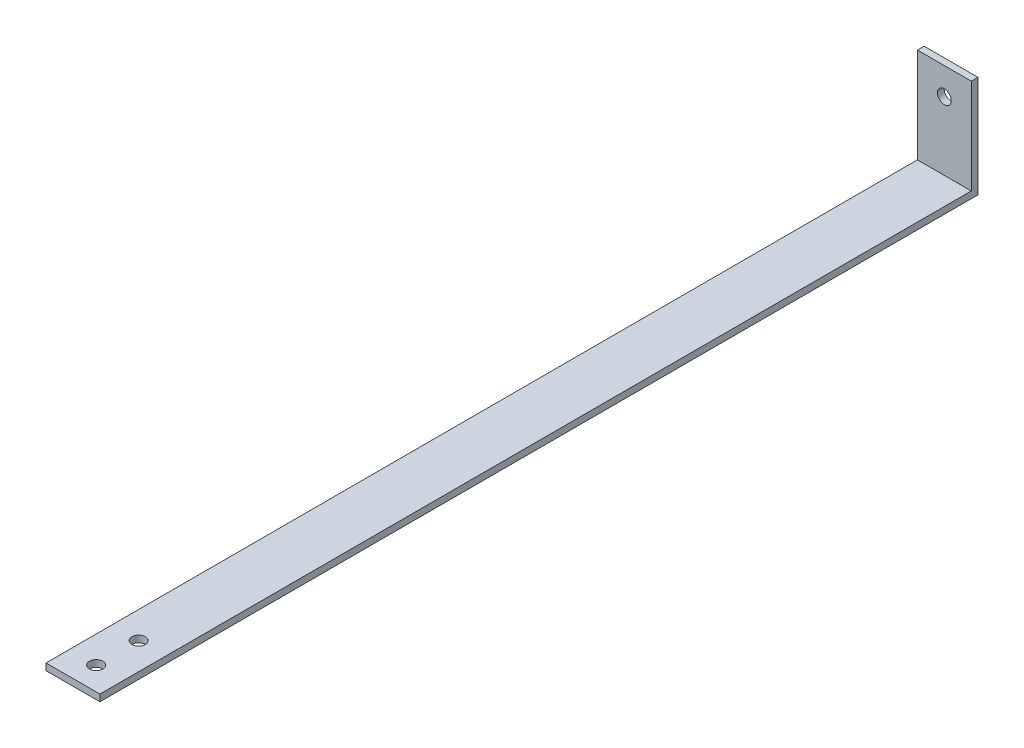
ISO-10303-21;
HEADER;
FILE_DESCRIPTION(('STEP AP214'),'2;1');
FILE_NAME('part.step','',(''),(''),'','','');
FILE_SCHEMA(('AUTOMOTIVE_DESIGN { 1 0 10303 214 1 1 1 1 }'));
ENDSEC;
DATA;
#1=APPLICATION_CONTEXT('core data for automotive mechanical design processes');
#2=APPLICATION_PROTOCOL_DEFINITION('international standard','automotive_design',2000,#1);
#3=PRODUCT_CONTEXT('',#1,'mechanical');
#4=PRODUCT('Part','Part','',(#3));
#5=PRODUCT_RELATED_PRODUCT_CATEGORY('part','',(#4));
#6=PRODUCT_DEFINITION_FORMATION('','',#4);
#7=PRODUCT_DEFINITION_CONTEXT('part definition',#1,'design');
#8=PRODUCT_DEFINITION('design','',#6,#7);
#9=PRODUCT_DEFINITION_SHAPE('','',#8);
#10=(LENGTH_UNIT() NAMED_UNIT(*) SI_UNIT(.MILLI.,.METRE.));
#11=(NAMED_UNIT(*) PLANE_ANGLE_UNIT() SI_UNIT($,.RADIAN.));
#12=(NAMED_UNIT(*) SI_UNIT($,.STERADIAN.) SOLID_ANGLE_UNIT());
#13=UNCERTAINTY_MEASURE_WITH_UNIT(LENGTH_MEASURE(1.E-05),#10,'distance_accuracy_value','');
#14=(GEOMETRIC_REPRESENTATION_CONTEXT(3) GLOBAL_UNCERTAINTY_ASSIGNED_CONTEXT((#13)) GLOBAL_UNIT_ASSIGNED_CONTEXT((#10,
#11,#12)) REPRESENTATION_CONTEXT('',''));
#15=CARTESIAN_POINT('',(0.,0.,0.));
#16=DIRECTION('',(0.,0.,1.));
#17=DIRECTION('',(1.,0.,0.));
#18=AXIS2_PLACEMENT_3D('',#15,#16,#17);
#19=CARTESIAN_POINT('',(50.8,6.3099999999999,6.31000000000004));
#20=DIRECTION('',(0.,0.,-1.));
#21=DIRECTION('',(0.,1.,0.));
#22=AXIS2_PLACEMENT_3D('',#19,#20,#21);
#23=PLANE('',#22);
#24=CARTESIAN_POINT('',(25.4,70.53,6.31000000000003));
#25=DIRECTION('',(0.,0.,-1.));
#26=DIRECTION('',(0.,1.,0.));
#27=AXIS2_PLACEMENT_3D('',#24,#25,#26);
#28=CIRCLE('',#27,6.5);
#29=CARTESIAN_POINT('',(25.4,77.03,6.31000000000003));
#30=VERTEX_POINT('',#29);
#31=EDGE_CURVE('E130',#30,#30,#28,.T.);
#32=ORIENTED_EDGE('',*,*,#31,.T.);
#33=EDGE_LOOP('',(#32));
#34=FACE_BOUND('',#33,.T.);
#35=DIRECTION('',(0.,-1.,0.));
#36=VECTOR('',#35,1.);
#37=CARTESIAN_POINT('',(0.,6.3099999999999,6.31000000000004));
#38=LINE('',#37,#36);
#39=CARTESIAN_POINT('',(0.,95.93,6.31000000000003));
#40=VERTEX_POINT('',#39);
#41=CARTESIAN_POINT('',(0.,6.3099999999999,6.31000000000004));
#42=VERTEX_POINT('',#41);
#43=EDGE_CURVE('E113',#40,#42,#38,.T.);
#44=ORIENTED_EDGE('',*,*,#43,.T.);
#45=DIRECTION('',(-1.,0.,0.));
#46=VECTOR('',#45,1.);
#47=CARTESIAN_POINT('',(50.8,6.3099999999999,6.31000000000004));
#48=LINE('',#47,#46);
#49=CARTESIAN_POINT('',(50.8,6.3099999999999,6.31000000000004));
#50=VERTEX_POINT('',#49);
#51=EDGE_CURVE('E39',#50,#42,#48,.T.);
#52=ORIENTED_EDGE('',*,*,#51,.F.);
#53=DIRECTION('',(0.,-1.,0.));
#54=VECTOR('',#53,1.);
#55=CARTESIAN_POINT('',(50.8,6.3099999999999,6.31000000000004));
#56=LINE('',#55,#54);
#57=CARTESIAN_POINT('',(50.8,95.93,6.31000000000003));
#58=VERTEX_POINT('',#57);
#59=EDGE_CURVE('E118',#58,#50,#56,.T.);
#60=ORIENTED_EDGE('',*,*,#59,.F.);
#61=DIRECTION('',(-1.,0.,0.));
#62=VECTOR('',#61,1.);
#63=CARTESIAN_POINT('',(50.8,95.93,6.31000000000003));
#64=LINE('',#63,#62);
#65=EDGE_CURVE('E119',#58,#40,#64,.T.);
#66=ORIENTED_EDGE('',*,*,#65,.T.);
#67=EDGE_LOOP('',(#44,#52,#60,#66));
#68=FACE_BOUND('',#67,.T.);
#69=ADVANCED_FACE('F32',(#34,#68),#23,.F.);
#70=CARTESIAN_POINT('',(50.8,6.30999999999989,902.2));
#71=DIRECTION('',(0.,-1.,0.));
#72=DIRECTION('',(0.,0.,-1.));
#73=AXIS2_PLACEMENT_3D('',#70,#71,#72);
#74=PLANE('',#73);
#75=CARTESIAN_POINT('',(25.4000000000114,6.30999999999989,805.810000000098));
#76=DIRECTION('',(0.,-1.,0.));
#77=DIRECTION('',(0.,0.,-1.));
#78=AXIS2_PLACEMENT_3D('',#75,#76,#77);
#79=CIRCLE('',#78,6.34999999999976);
#80=CARTESIAN_POINT('',(25.4000000000114,6.30999999999989,799.460000000098));
#81=VERTEX_POINT('',#80);
#82=EDGE_CURVE('E150',#81,#81,#79,.T.);
#83=ORIENTED_EDGE('',*,*,#82,.T.);
#84=EDGE_LOOP('',(#83));
#85=FACE_BOUND('',#84,.T.);
#86=CARTESIAN_POINT('',(25.4000000000121,6.30999999999989,765.810000000098));
#87=DIRECTION('',(0.,-1.,0.));
#88=DIRECTION('',(0.,0.,-1.));
#89=AXIS2_PLACEMENT_3D('',#86,#87,#88);
#90=CIRCLE('',#89,6.34999999999969);
#91=CARTESIAN_POINT('',(25.4000000000121,6.30999999999989,759.460000000098));
#92=VERTEX_POINT('',#91);
#93=EDGE_CURVE('E105',#92,#92,#90,.T.);
#94=ORIENTED_EDGE('',*,*,#93,.T.);
#95=EDGE_LOOP('',(#94));
#96=FACE_BOUND('',#95,.T.);
#97=DIRECTION('',(0.,0.,1.));
#98=VECTOR('',#97,1.);
#99=CARTESIAN_POINT('',(0.,6.30999999999989,902.2));
#100=LINE('',#99,#98);
#101=CARTESIAN_POINT('',(0.,6.30999999999989,827.7));
#102=VERTEX_POINT('',#101);
#103=EDGE_CURVE('E110',#42,#102,#100,.T.);
#104=ORIENTED_EDGE('',*,*,#103,.T.);
#105=DIRECTION('',(1.,0.,0.));
#106=VECTOR('',#105,1.);
#107=CARTESIAN_POINT('',(50.8,6.30999999999989,827.7));
#108=LINE('',#107,#106);
#109=CARTESIAN_POINT('',(50.8,6.3099999999999,827.7));
#110=VERTEX_POINT('',#109);
#111=EDGE_CURVE('E45',#102,#110,#108,.T.);
#112=ORIENTED_EDGE('',*,*,#111,.T.);
#113=DIRECTION('',(0.,0.,1.));
#114=VECTOR('',#113,1.);
#115=CARTESIAN_POINT('',(50.8,6.30999999999989,902.2));
#116=LINE('',#115,#114);
#117=EDGE_CURVE('E82',#50,#110,#116,.T.);
#118=ORIENTED_EDGE('',*,*,#117,.F.);
#119=ORIENTED_EDGE('',*,*,#51,.T.);
#120=EDGE_LOOP('',(#104,#112,#118,#119));
#121=FACE_BOUND('',#120,.T.);
#122=ADVANCED_FACE('F126',(#85,#96,#121),#74,.F.);
#123=CARTESIAN_POINT('',(50.8,0.,0.));
#124=DIRECTION('',(0.,1.,0.));
#125=DIRECTION('',(0.,0.,1.));
#126=AXIS2_PLACEMENT_3D('',#123,#124,#125);
#127=PLANE('',#126);
#128=CARTESIAN_POINT('',(25.4000000000114,0.,805.810000000098));
#129=DIRECTION('',(0.,-1.,0.));
#130=DIRECTION('',(0.,0.,-1.));
#131=AXIS2_PLACEMENT_3D('',#128,#129,#130);
#132=CIRCLE('',#131,6.34999999999976);
#133=CARTESIAN_POINT('',(25.4000000000114,0.,799.460000000098));
#134=VERTEX_POINT('',#133);
#135=EDGE_CURVE('E153',#134,#134,#132,.T.);
#136=ORIENTED_EDGE('',*,*,#135,.F.);
#137=EDGE_LOOP('',(#136));
#138=FACE_BOUND('',#137,.T.);
#139=CARTESIAN_POINT('',(25.4000000000121,0.,765.810000000098));
#140=DIRECTION('',(0.,-1.,0.));
#141=DIRECTION('',(0.,0.,-1.));
#142=AXIS2_PLACEMENT_3D('',#139,#140,#141);
#143=CIRCLE('',#142,6.34999999999969);
#144=CARTESIAN_POINT('',(25.4000000000121,0.,759.460000000098));
#145=VERTEX_POINT('',#144);
#146=EDGE_CURVE('E147',#145,#145,#143,.T.);
#147=ORIENTED_EDGE('',*,*,#146,.F.);
#148=EDGE_LOOP('',(#147));
#149=FACE_BOUND('',#148,.T.);
#150=DIRECTION('',(0.,0.,-1.));
#151=VECTOR('',#150,1.);
#152=CARTESIAN_POINT('',(50.8,0.,0.));
#153=LINE('',#152,#151);
#154=CARTESIAN_POINT('',(50.8,-1.01364015565426E-13,827.7));
#155=VERTEX_POINT('',#154);
#156=CARTESIAN_POINT('',(50.8,0.,0.));
#157=VERTEX_POINT('',#156);
#158=EDGE_CURVE('E103',#155,#157,#153,.T.);
#159=ORIENTED_EDGE('',*,*,#158,.F.);
#160=DIRECTION('',(1.,0.,0.));
#161=VECTOR('',#160,1.);
#162=CARTESIAN_POINT('',(50.8,-1.01364015565426E-13,827.7));
#163=LINE('',#162,#161);
#164=CARTESIAN_POINT('',(0.,-1.01364015565426E-13,827.7));
#165=VERTEX_POINT('',#164);
#166=EDGE_CURVE('E92',#165,#155,#163,.T.);
#167=ORIENTED_EDGE('',*,*,#166,.F.);
#168=DIRECTION('',(0.,0.,-1.));
#169=VECTOR('',#168,1.);
#170=CARTESIAN_POINT('',(0.,0.,0.));
#171=LINE('',#170,#169);
#172=CARTESIAN_POINT('',(0.,0.,0.));
#173=VERTEX_POINT('',#172);
#174=EDGE_CURVE('E101',#165,#173,#171,.T.);
#175=ORIENTED_EDGE('',*,*,#174,.T.);
#176=DIRECTION('',(-1.,0.,0.));
#177=VECTOR('',#176,1.);
#178=CARTESIAN_POINT('',(50.8,0.,0.));
#179=LINE('',#178,#177);
#180=EDGE_CURVE('E123',#157,#173,#179,.T.);
#181=ORIENTED_EDGE('',*,*,#180,.F.);
#182=EDGE_LOOP('',(#159,#167,#175,#181));
#183=FACE_BOUND('',#182,.T.);
#184=ADVANCED_FACE('F99',(#138,#149,#183),#127,.F.);
#185=CARTESIAN_POINT('',(50.8,95.93,0.));
#186=DIRECTION('',(0.,0.,1.));
#187=DIRECTION('',(0.,-1.,0.));
#188=AXIS2_PLACEMENT_3D('',#185,#186,#187);
#189=PLANE('',#188);
#190=CARTESIAN_POINT('',(25.4,70.53,0.));
#191=DIRECTION('',(0.,0.,-1.));
#192=DIRECTION('',(0.,1.,0.));
#193=AXIS2_PLACEMENT_3D('',#190,#191,#192);
#194=CIRCLE('',#193,6.5);
#195=CARTESIAN_POINT('',(25.4,77.03,0.));
#196=VERTEX_POINT('',#195);
#197=EDGE_CURVE('E132',#196,#196,#194,.T.);
#198=ORIENTED_EDGE('',*,*,#197,.F.);
#199=EDGE_LOOP('',(#198));
#200=FACE_BOUND('',#199,.T.);
#201=DIRECTION('',(0.,1.,0.));
#202=VECTOR('',#201,1.);
#203=CARTESIAN_POINT('',(0.,95.93,0.));
#204=LINE('',#203,#202);
#205=CARTESIAN_POINT('',(0.,95.93,0.));
#206=VERTEX_POINT('',#205);
#207=EDGE_CURVE('E109',#173,#206,#204,.T.);
#208=ORIENTED_EDGE('',*,*,#207,.T.);
#209=DIRECTION('',(-1.,0.,0.));
#210=VECTOR('',#209,1.);
#211=CARTESIAN_POINT('',(50.8,95.93,0.));
#212=LINE('',#211,#210);
#213=CARTESIAN_POINT('',(50.8,95.93,0.));
#214=VERTEX_POINT('',#213);
#215=EDGE_CURVE('E121',#214,#206,#212,.T.);
#216=ORIENTED_EDGE('',*,*,#215,.F.);
#217=DIRECTION('',(0.,1.,0.));
#218=VECTOR('',#217,1.);
#219=CARTESIAN_POINT('',(50.8,95.93,0.));
#220=LINE('',#219,#218);
#221=EDGE_CURVE('E136',#157,#214,#220,.T.);
#222=ORIENTED_EDGE('',*,*,#221,.F.);
#223=ORIENTED_EDGE('',*,*,#180,.T.);
#224=EDGE_LOOP('',(#208,#216,#222,#223));
#225=FACE_BOUND('',#224,.T.);
#226=ADVANCED_FACE('F162',(#200,#225),#189,.F.);
#227=CARTESIAN_POINT('',(50.8,95.93,6.31000000000003));
#228=DIRECTION('',(0.,-1.,0.));
#229=DIRECTION('',(0.,0.,-1.));
#230=AXIS2_PLACEMENT_3D('',#227,#228,#229);
#231=PLANE('',#230);
#232=DIRECTION('',(0.,0.,1.));
#233=VECTOR('',#232,1.);
#234=CARTESIAN_POINT('',(0.,95.93,6.31000000000003));
#235=LINE('',#234,#233);
#236=EDGE_CURVE('E75',#206,#40,#235,.T.);
#237=ORIENTED_EDGE('',*,*,#236,.T.);
#238=ORIENTED_EDGE('',*,*,#65,.F.);
#239=DIRECTION('',(0.,0.,1.));
#240=VECTOR('',#239,1.);
#241=CARTESIAN_POINT('',(50.8,95.93,6.31000000000003));
#242=LINE('',#241,#240);
#243=EDGE_CURVE('E54',#214,#58,#242,.T.);
#244=ORIENTED_EDGE('',*,*,#243,.F.);
#245=ORIENTED_EDGE('',*,*,#215,.T.);
#246=EDGE_LOOP('',(#237,#238,#244,#245));
#247=FACE_BOUND('',#246,.T.);
#248=ADVANCED_FACE('F181',(#247),#231,.F.);
#249=CARTESIAN_POINT('',(50.8,0.,0.));
#250=DIRECTION('',(-1.,0.,0.));
#251=DIRECTION('',(0.,0.,1.));
#252=AXIS2_PLACEMENT_3D('',#249,#250,#251);
#253=PLANE('',#252);
#254=ORIENTED_EDGE('',*,*,#117,.T.);
#255=DIRECTION('',(0.,-1.,0.));
#256=VECTOR('',#255,1.);
#257=CARTESIAN_POINT('',(50.8,9.9999999999999,827.7));
#258=LINE('',#257,#256);
#259=EDGE_CURVE('E104',#110,#155,#258,.T.);
#260=ORIENTED_EDGE('',*,*,#259,.T.);
#261=ORIENTED_EDGE('',*,*,#158,.T.);
#262=ORIENTED_EDGE('',*,*,#221,.T.);
#263=ORIENTED_EDGE('',*,*,#243,.T.);
#264=ORIENTED_EDGE('',*,*,#59,.T.);
#265=EDGE_LOOP('',(#254,#260,#261,#262,#263,#264));
#266=FACE_BOUND('',#265,.T.);
#267=ADVANCED_FACE('F185',(#266),#253,.F.);
#268=CARTESIAN_POINT('',(0.,0.,0.));
#269=DIRECTION('',(-1.,0.,0.));
#270=DIRECTION('',(0.,0.,1.));
#271=AXIS2_PLACEMENT_3D('',#268,#269,#270);
#272=PLANE('',#271);
#273=DIRECTION('',(0.,-1.,0.));
#274=VECTOR('',#273,1.);
#275=CARTESIAN_POINT('',(0.,-1.01364015565426E-13,827.7));
#276=LINE('',#275,#274);
#277=EDGE_CURVE('E11',#102,#165,#276,.T.);
#278=ORIENTED_EDGE('',*,*,#277,.F.);
#279=ORIENTED_EDGE('',*,*,#103,.F.);
#280=ORIENTED_EDGE('',*,*,#43,.F.);
#281=ORIENTED_EDGE('',*,*,#236,.F.);
#282=ORIENTED_EDGE('',*,*,#207,.F.);
#283=ORIENTED_EDGE('',*,*,#174,.F.);
#284=EDGE_LOOP('',(#278,#279,#280,#281,#282,#283));
#285=FACE_BOUND('',#284,.T.);
#286=ADVANCED_FACE('F108',(#285),#272,.T.);
#287=CARTESIAN_POINT('',(25.4,70.53,10.));
#288=DIRECTION('',(0.,0.,-1.));
#289=DIRECTION('',(0.,1.,0.));
#290=AXIS2_PLACEMENT_3D('',#287,#288,#289);
#291=CYLINDRICAL_SURFACE('',#290,6.5);
#292=ORIENTED_EDGE('',*,*,#197,.T.);
#293=EDGE_LOOP('',(#292));
#294=FACE_BOUND('',#293,.T.);
#295=ORIENTED_EDGE('',*,*,#31,.F.);
#296=EDGE_LOOP('',(#295));
#297=FACE_BOUND('',#296,.T.);
#298=ADVANCED_FACE('F188',(#294,#297),#291,.F.);
#299=CARTESIAN_POINT('',(50.8,9.9999999999999,827.7));
#300=DIRECTION('',(0.,0.,-1.));
#301=DIRECTION('',(0.,1.,0.));
#302=AXIS2_PLACEMENT_3D('',#299,#300,#301);
#303=PLANE('',#302);
#304=ORIENTED_EDGE('',*,*,#277,.T.);
#305=ORIENTED_EDGE('',*,*,#166,.T.);
#306=ORIENTED_EDGE('',*,*,#259,.F.);
#307=ORIENTED_EDGE('',*,*,#111,.F.);
#308=EDGE_LOOP('',(#304,#305,#306,#307));
#309=FACE_BOUND('',#308,.T.);
#310=ADVANCED_FACE('F91',(#309),#303,.F.);
#311=CARTESIAN_POINT('',(25.4000000000121,9.99999999999991,765.810000000098));
#312=DIRECTION('',(0.,-1.,0.));
#313=DIRECTION('',(0.,0.,-1.));
#314=AXIS2_PLACEMENT_3D('',#311,#312,#313);
#315=CYLINDRICAL_SURFACE('',#314,6.34999999999969);
#316=ORIENTED_EDGE('',*,*,#146,.T.);
#317=EDGE_LOOP('',(#316));
#318=FACE_BOUND('',#317,.T.);
#319=ORIENTED_EDGE('',*,*,#93,.F.);
#320=EDGE_LOOP('',(#319));
#321=FACE_BOUND('',#320,.T.);
#322=ADVANCED_FACE('F166',(#318,#321),#315,.F.);
#323=CARTESIAN_POINT('',(25.4000000000114,9.9999999999999,805.810000000098));
#324=DIRECTION('',(0.,-1.,0.));
#325=DIRECTION('',(0.,0.,-1.));
#326=AXIS2_PLACEMENT_3D('',#323,#324,#325);
#327=CYLINDRICAL_SURFACE('',#326,6.34999999999976);
#328=ORIENTED_EDGE('',*,*,#135,.T.);
#329=EDGE_LOOP('',(#328));
#330=FACE_BOUND('',#329,.T.);
#331=ORIENTED_EDGE('',*,*,#82,.F.);
#332=EDGE_LOOP('',(#331));
#333=FACE_BOUND('',#332,.T.);
#334=ADVANCED_FACE('F157',(#330,#333),#327,.F.);
#335=CLOSED_SHELL('',(#69,#122,#184,#226,#248,#267,#286,#298,#310,#322,#334));
#336=MANIFOLD_SOLID_BREP('B2',#335);
#337=ADVANCED_BREP_SHAPE_REPRESENTATION('',(#18,#336),#14);
#338=SHAPE_DEFINITION_REPRESENTATION(#9,#337);
ENDSEC;
END-ISO-10303-21;
